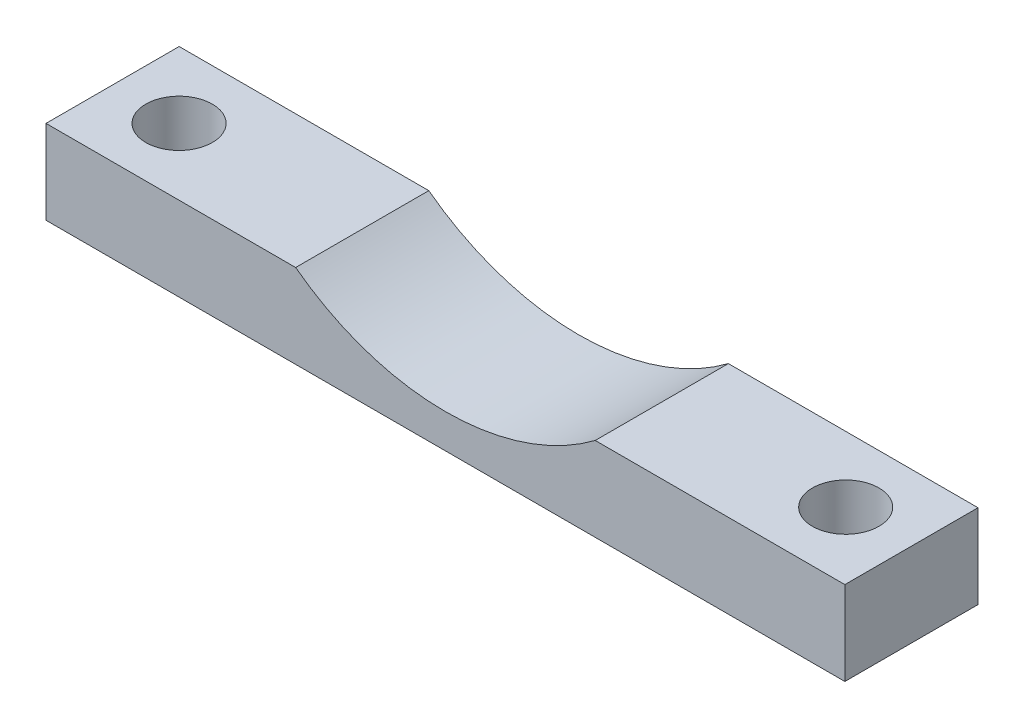
ISO-10303-21;
HEADER;
FILE_DESCRIPTION(('STEP AP214'),'2;1');
FILE_NAME('part.step','',(''),(''),'','','');
FILE_SCHEMA(('AUTOMOTIVE_DESIGN { 1 0 10303 214 1 1 1 1 }'));
ENDSEC;
DATA;
#1=APPLICATION_CONTEXT('core data for automotive mechanical design processes');
#2=APPLICATION_PROTOCOL_DEFINITION('international standard','automotive_design',2000,#1);
#3=PRODUCT_CONTEXT('',#1,'mechanical');
#4=PRODUCT('Part','Part','',(#3));
#5=PRODUCT_RELATED_PRODUCT_CATEGORY('part','',(#4));
#6=PRODUCT_DEFINITION_FORMATION('','',#4);
#7=PRODUCT_DEFINITION_CONTEXT('part definition',#1,'design');
#8=PRODUCT_DEFINITION('design','',#6,#7);
#9=PRODUCT_DEFINITION_SHAPE('','',#8);
#10=(LENGTH_UNIT() NAMED_UNIT(*) SI_UNIT(.MILLI.,.METRE.));
#11=(NAMED_UNIT(*) PLANE_ANGLE_UNIT() SI_UNIT($,.RADIAN.));
#12=(NAMED_UNIT(*) SI_UNIT($,.STERADIAN.) SOLID_ANGLE_UNIT());
#13=UNCERTAINTY_MEASURE_WITH_UNIT(LENGTH_MEASURE(1.E-05),#10,'distance_accuracy_value','');
#14=(GEOMETRIC_REPRESENTATION_CONTEXT(3) GLOBAL_UNCERTAINTY_ASSIGNED_CONTEXT((#13)) GLOBAL_UNIT_ASSIGNED_CONTEXT((#10,
#11,#12)) REPRESENTATION_CONTEXT('',''));
#15=CARTESIAN_POINT('',(0.,0.,0.));
#16=DIRECTION('',(0.,0.,1.));
#17=DIRECTION('',(1.,0.,0.));
#18=AXIS2_PLACEMENT_3D('',#15,#16,#17);
#19=CARTESIAN_POINT('',(0.0140913550925603,-0.0271199820524089,10.16));
#20=DIRECTION('',(0.,0.,-1.));
#21=DIRECTION('',(-1.,0.,0.));
#22=AXIS2_PLACEMENT_3D('',#19,#20,#21);
#23=CYLINDRICAL_SURFACE('',#22,19.05);
#24=CARTESIAN_POINT('',(0.0140913550925603,-0.0271199820524089,0.));
#25=DIRECTION('',(0.,0.,-1.));
#26=DIRECTION('',(1.,0.,0.));
#27=AXIS2_PLACEMENT_3D('',#24,#25,#26);
#28=CIRCLE('',#27,19.05);
#29=CARTESIAN_POINT('',(11.4440913550926,-15.2671199820524,0.));
#30=VERTEX_POINT('',#29);
#31=CARTESIAN_POINT('',(-11.4159086449074,-15.2671199820524,0.));
#32=VERTEX_POINT('',#31);
#33=EDGE_CURVE('E123',#30,#32,#28,.T.);
#34=ORIENTED_EDGE('',*,*,#33,.T.);
#35=DIRECTION('',(0.,0.,-1.));
#36=VECTOR('',#35,1.);
#37=CARTESIAN_POINT('',(-11.4159086449074,-15.2671199820524,10.16));
#38=LINE('',#37,#36);
#39=CARTESIAN_POINT('',(-11.4159086449074,-15.2671199820524,10.16));
#40=VERTEX_POINT('',#39);
#41=EDGE_CURVE('E11',#40,#32,#38,.T.);
#42=ORIENTED_EDGE('',*,*,#41,.F.);
#43=CARTESIAN_POINT('',(0.0140913550925603,-0.0271199820524089,10.16));
#44=DIRECTION('',(0.,0.,-1.));
#45=DIRECTION('',(1.,0.,0.));
#46=AXIS2_PLACEMENT_3D('',#43,#44,#45);
#47=CIRCLE('',#46,19.05);
#48=CARTESIAN_POINT('',(11.4440913550926,-15.2671199820524,10.16));
#49=VERTEX_POINT('',#48);
#50=EDGE_CURVE('E134',#49,#40,#47,.T.);
#51=ORIENTED_EDGE('',*,*,#50,.F.);
#52=DIRECTION('',(0.,0.,-1.));
#53=VECTOR('',#52,1.);
#54=CARTESIAN_POINT('',(11.4440913550926,-15.2671199820524,10.16));
#55=LINE('',#54,#53);
#56=EDGE_CURVE('E119',#49,#30,#55,.T.);
#57=ORIENTED_EDGE('',*,*,#56,.T.);
#58=EDGE_LOOP('',(#34,#42,#51,#57));
#59=FACE_BOUND('',#58,.T.);
#60=ADVANCED_FACE('F39',(#59),#23,.F.);
#61=CARTESIAN_POINT('',(-11.4159086449074,-15.2671199820524,10.16));
#62=DIRECTION('',(0.,-1.,0.));
#63=DIRECTION('',(1.,0.,0.));
#64=AXIS2_PLACEMENT_3D('',#61,#62,#63);
#65=PLANE('',#64);
#66=CARTESIAN_POINT('',(-25.3929543224537,-15.2671199820524,5.08));
#67=DIRECTION('',(0.,1.,0.));
#68=DIRECTION('',(-1.,0.,0.));
#69=AXIS2_PLACEMENT_3D('',#66,#67,#68);
#70=CIRCLE('',#69,2.54);
#71=CARTESIAN_POINT('',(-27.9329543224537,-15.2671199820524,5.08));
#72=VERTEX_POINT('',#71);
#73=EDGE_CURVE('E185',#72,#72,#70,.T.);
#74=ORIENTED_EDGE('',*,*,#73,.F.);
#75=EDGE_LOOP('',(#74));
#76=FACE_BOUND('',#75,.T.);
#77=DIRECTION('',(-1.,0.,0.));
#78=VECTOR('',#77,1.);
#79=CARTESIAN_POINT('',(-11.4159086449074,-15.2671199820524,0.));
#80=LINE('',#79,#78);
#81=CARTESIAN_POINT('',(-30.4659086449074,-15.2671199820524,0.));
#82=VERTEX_POINT('',#81);
#83=EDGE_CURVE('E126',#32,#82,#80,.T.);
#84=ORIENTED_EDGE('',*,*,#83,.T.);
#85=DIRECTION('',(0.,0.,-1.));
#86=VECTOR('',#85,1.);
#87=CARTESIAN_POINT('',(-30.4659086449074,-15.2671199820524,10.16));
#88=LINE('',#87,#86);
#89=CARTESIAN_POINT('',(-30.4659086449074,-15.2671199820524,10.16));
#90=VERTEX_POINT('',#89);
#91=EDGE_CURVE('E47',#90,#82,#88,.T.);
#92=ORIENTED_EDGE('',*,*,#91,.F.);
#93=DIRECTION('',(-1.,0.,0.));
#94=VECTOR('',#93,1.);
#95=CARTESIAN_POINT('',(-11.4159086449074,-15.2671199820524,10.16));
#96=LINE('',#95,#94);
#97=EDGE_CURVE('E92',#40,#90,#96,.T.);
#98=ORIENTED_EDGE('',*,*,#97,.F.);
#99=ORIENTED_EDGE('',*,*,#41,.T.);
#100=EDGE_LOOP('',(#84,#92,#98,#99));
#101=FACE_BOUND('',#100,.T.);
#102=ADVANCED_FACE('F160',(#76,#101),#65,.F.);
#103=CARTESIAN_POINT('',(-30.4659086449074,-15.2671199820524,10.16));
#104=DIRECTION('',(1.,0.,0.));
#105=DIRECTION('',(0.,0.,-1.));
#106=AXIS2_PLACEMENT_3D('',#103,#104,#105);
#107=PLANE('',#106);
#108=DIRECTION('',(0.,-1.,0.));
#109=VECTOR('',#108,1.);
#110=CARTESIAN_POINT('',(-30.4659086449074,-15.2671199820524,0.));
#111=LINE('',#110,#109);
#112=CARTESIAN_POINT('',(-30.4659086449074,-21.6713190814874,0.));
#113=VERTEX_POINT('',#112);
#114=EDGE_CURVE('E129',#82,#113,#111,.T.);
#115=ORIENTED_EDGE('',*,*,#114,.T.);
#116=DIRECTION('',(0.,0.,-1.));
#117=VECTOR('',#116,1.);
#118=CARTESIAN_POINT('',(-30.4659086449074,-21.6713190814874,10.16));
#119=LINE('',#118,#117);
#120=CARTESIAN_POINT('',(-30.4659086449074,-21.6713190814874,10.16));
#121=VERTEX_POINT('',#120);
#122=EDGE_CURVE('E114',#121,#113,#119,.T.);
#123=ORIENTED_EDGE('',*,*,#122,.F.);
#124=DIRECTION('',(0.,-1.,0.));
#125=VECTOR('',#124,1.);
#126=CARTESIAN_POINT('',(-30.4659086449074,-15.2671199820524,10.16));
#127=LINE('',#126,#125);
#128=EDGE_CURVE('E105',#90,#121,#127,.T.);
#129=ORIENTED_EDGE('',*,*,#128,.F.);
#130=ORIENTED_EDGE('',*,*,#91,.T.);
#131=EDGE_LOOP('',(#115,#123,#129,#130));
#132=FACE_BOUND('',#131,.T.);
#133=ADVANCED_FACE('F140',(#132),#107,.F.);
#134=CARTESIAN_POINT('',(-30.4659086449074,-21.6713190814874,10.16));
#135=DIRECTION('',(0.,1.,0.));
#136=DIRECTION('',(0.,0.,1.));
#137=AXIS2_PLACEMENT_3D('',#134,#135,#136);
#138=PLANE('',#137);
#139=CARTESIAN_POINT('',(-25.3929543224537,-21.6713190814874,5.08));
#140=DIRECTION('',(0.,1.,0.));
#141=DIRECTION('',(-1.,0.,0.));
#142=AXIS2_PLACEMENT_3D('',#139,#140,#141);
#143=CIRCLE('',#142,2.54);
#144=CARTESIAN_POINT('',(-27.9329543224537,-21.6713190814874,5.08));
#145=VERTEX_POINT('',#144);
#146=EDGE_CURVE('E127',#145,#145,#143,.T.);
#147=ORIENTED_EDGE('',*,*,#146,.T.);
#148=EDGE_LOOP('',(#147));
#149=FACE_BOUND('',#148,.T.);
#150=CARTESIAN_POINT('',(25.4069479581042,-21.6713190814874,5.00954336006865));
#151=DIRECTION('',(0.,1.,0.));
#152=DIRECTION('',(1.,0.,0.));
#153=AXIS2_PLACEMENT_3D('',#150,#151,#152);
#154=CIRCLE('',#153,2.54);
#155=CARTESIAN_POINT('',(27.9469479581042,-21.6713190814874,5.00954336006865));
#156=VERTEX_POINT('',#155);
#157=EDGE_CURVE('E180',#156,#156,#154,.T.);
#158=ORIENTED_EDGE('',*,*,#157,.T.);
#159=EDGE_LOOP('',(#158));
#160=FACE_BOUND('',#159,.T.);
#161=DIRECTION('',(1.,0.,0.));
#162=VECTOR('',#161,1.);
#163=CARTESIAN_POINT('',(-30.4659086449074,-21.6713190814874,0.));
#164=LINE('',#163,#162);
#165=CARTESIAN_POINT('',(30.4940913550926,-21.6713190814874,0.));
#166=VERTEX_POINT('',#165);
#167=EDGE_CURVE('E113',#113,#166,#164,.T.);
#168=ORIENTED_EDGE('',*,*,#167,.T.);
#169=DIRECTION('',(0.,0.,-1.));
#170=VECTOR('',#169,1.);
#171=CARTESIAN_POINT('',(30.4940913550926,-21.6713190814874,10.16));
#172=LINE('',#171,#170);
#173=CARTESIAN_POINT('',(30.4940913550926,-21.6713190814874,10.16));
#174=VERTEX_POINT('',#173);
#175=EDGE_CURVE('E110',#174,#166,#172,.T.);
#176=ORIENTED_EDGE('',*,*,#175,.F.);
#177=DIRECTION('',(1.,0.,0.));
#178=VECTOR('',#177,1.);
#179=CARTESIAN_POINT('',(-30.4659086449074,-21.6713190814874,10.16));
#180=LINE('',#179,#178);
#181=EDGE_CURVE('E99',#121,#174,#180,.T.);
#182=ORIENTED_EDGE('',*,*,#181,.F.);
#183=ORIENTED_EDGE('',*,*,#122,.T.);
#184=EDGE_LOOP('',(#168,#176,#182,#183));
#185=FACE_BOUND('',#184,.T.);
#186=ADVANCED_FACE('F111',(#149,#160,#185),#138,.F.);
#187=CARTESIAN_POINT('',(30.4940913550926,-21.6713190814874,10.16));
#188=DIRECTION('',(-1.,0.,0.));
#189=DIRECTION('',(0.,0.,1.));
#190=AXIS2_PLACEMENT_3D('',#187,#188,#189);
#191=PLANE('',#190);
#192=DIRECTION('',(0.,1.,0.));
#193=VECTOR('',#192,1.);
#194=CARTESIAN_POINT('',(30.4940913550926,-21.6713190814874,0.));
#195=LINE('',#194,#193);
#196=CARTESIAN_POINT('',(30.4940913550926,-15.2671199820524,0.));
#197=VERTEX_POINT('',#196);
#198=EDGE_CURVE('E78',#166,#197,#195,.T.);
#199=ORIENTED_EDGE('',*,*,#198,.T.);
#200=DIRECTION('',(0.,0.,-1.));
#201=VECTOR('',#200,1.);
#202=CARTESIAN_POINT('',(30.4940913550926,-15.2671199820524,10.16));
#203=LINE('',#202,#201);
#204=CARTESIAN_POINT('',(30.4940913550926,-15.2671199820524,10.16));
#205=VERTEX_POINT('',#204);
#206=EDGE_CURVE('E115',#205,#197,#203,.T.);
#207=ORIENTED_EDGE('',*,*,#206,.F.);
#208=DIRECTION('',(0.,1.,0.));
#209=VECTOR('',#208,1.);
#210=CARTESIAN_POINT('',(30.4940913550926,-21.6713190814874,10.16));
#211=LINE('',#210,#209);
#212=EDGE_CURVE('E103',#174,#205,#211,.T.);
#213=ORIENTED_EDGE('',*,*,#212,.F.);
#214=ORIENTED_EDGE('',*,*,#175,.T.);
#215=EDGE_LOOP('',(#199,#207,#213,#214));
#216=FACE_BOUND('',#215,.T.);
#217=ADVANCED_FACE('F117',(#216),#191,.F.);
#218=CARTESIAN_POINT('',(11.4440913550926,-15.2671199820524,10.16));
#219=DIRECTION('',(0.,-1.,0.));
#220=DIRECTION('',(0.,0.,-1.));
#221=AXIS2_PLACEMENT_3D('',#218,#219,#220);
#222=PLANE('',#221);
#223=CARTESIAN_POINT('',(25.4069479581042,-15.2671199820524,5.00954336006865));
#224=DIRECTION('',(0.,1.,0.));
#225=DIRECTION('',(1.,0.,0.));
#226=AXIS2_PLACEMENT_3D('',#223,#224,#225);
#227=CIRCLE('',#226,2.54);
#228=CARTESIAN_POINT('',(27.9469479581042,-15.2671199820524,5.00954336006865));
#229=VERTEX_POINT('',#228);
#230=EDGE_CURVE('E182',#229,#229,#227,.T.);
#231=ORIENTED_EDGE('',*,*,#230,.F.);
#232=EDGE_LOOP('',(#231));
#233=FACE_BOUND('',#232,.T.);
#234=DIRECTION('',(-1.,0.,0.));
#235=VECTOR('',#234,1.);
#236=CARTESIAN_POINT('',(11.4440913550926,-15.2671199820524,0.));
#237=LINE('',#236,#235);
#238=EDGE_CURVE('E84',#197,#30,#237,.T.);
#239=ORIENTED_EDGE('',*,*,#238,.T.);
#240=ORIENTED_EDGE('',*,*,#56,.F.);
#241=DIRECTION('',(-1.,0.,0.));
#242=VECTOR('',#241,1.);
#243=CARTESIAN_POINT('',(11.4440913550926,-15.2671199820524,10.16));
#244=LINE('',#243,#242);
#245=EDGE_CURVE('E55',#205,#49,#244,.T.);
#246=ORIENTED_EDGE('',*,*,#245,.F.);
#247=ORIENTED_EDGE('',*,*,#206,.T.);
#248=EDGE_LOOP('',(#239,#240,#246,#247));
#249=FACE_BOUND('',#248,.T.);
#250=ADVANCED_FACE('F147',(#233,#249),#222,.F.);
#251=CARTESIAN_POINT('',(0.0140913550925603,-0.0271199820524089,10.16));
#252=DIRECTION('',(0.,0.,1.));
#253=DIRECTION('',(1.,0.,0.));
#254=AXIS2_PLACEMENT_3D('',#251,#252,#253);
#255=PLANE('',#254);
#256=ORIENTED_EDGE('',*,*,#50,.T.);
#257=ORIENTED_EDGE('',*,*,#97,.T.);
#258=ORIENTED_EDGE('',*,*,#128,.T.);
#259=ORIENTED_EDGE('',*,*,#181,.T.);
#260=ORIENTED_EDGE('',*,*,#212,.T.);
#261=ORIENTED_EDGE('',*,*,#245,.T.);
#262=EDGE_LOOP('',(#256,#257,#258,#259,#260,#261));
#263=FACE_BOUND('',#262,.T.);
#264=ADVANCED_FACE('F101',(#263),#255,.T.);
#265=CARTESIAN_POINT('',(0.0140913550925603,-0.0271199820524089,0.));
#266=DIRECTION('',(0.,0.,1.));
#267=DIRECTION('',(1.,0.,0.));
#268=AXIS2_PLACEMENT_3D('',#265,#266,#267);
#269=PLANE('',#268);
#270=ORIENTED_EDGE('',*,*,#33,.F.);
#271=ORIENTED_EDGE('',*,*,#238,.F.);
#272=ORIENTED_EDGE('',*,*,#198,.F.);
#273=ORIENTED_EDGE('',*,*,#167,.F.);
#274=ORIENTED_EDGE('',*,*,#114,.F.);
#275=ORIENTED_EDGE('',*,*,#83,.F.);
#276=EDGE_LOOP('',(#270,#271,#272,#273,#274,#275));
#277=FACE_BOUND('',#276,.T.);
#278=ADVANCED_FACE('F143',(#277),#269,.F.);
#279=CARTESIAN_POINT('',(25.4069479581042,-21.6713190814874,5.00954336006865));
#280=DIRECTION('',(0.,1.,0.));
#281=DIRECTION('',(-1.,0.,0.));
#282=AXIS2_PLACEMENT_3D('',#279,#280,#281);
#283=CYLINDRICAL_SURFACE('',#282,2.54);
#284=ORIENTED_EDGE('',*,*,#157,.F.);
#285=EDGE_LOOP('',(#284));
#286=FACE_BOUND('',#285,.T.);
#287=ORIENTED_EDGE('',*,*,#230,.T.);
#288=EDGE_LOOP('',(#287));
#289=FACE_BOUND('',#288,.T.);
#290=ADVANCED_FACE('F195',(#286,#289),#283,.F.);
#291=CARTESIAN_POINT('',(-25.3929543224537,-21.6713190814874,5.08));
#292=DIRECTION('',(0.,1.,0.));
#293=DIRECTION('',(-1.,0.,0.));
#294=AXIS2_PLACEMENT_3D('',#291,#292,#293);
#295=CYLINDRICAL_SURFACE('',#294,2.54);
#296=ORIENTED_EDGE('',*,*,#146,.F.);
#297=EDGE_LOOP('',(#296));
#298=FACE_BOUND('',#297,.T.);
#299=ORIENTED_EDGE('',*,*,#73,.T.);
#300=EDGE_LOOP('',(#299));
#301=FACE_BOUND('',#300,.T.);
#302=ADVANCED_FACE('F193',(#298,#301),#295,.F.);
#303=CLOSED_SHELL('',(#60,#102,#133,#186,#217,#250,#264,#278,#290,#302));
#304=MANIFOLD_SOLID_BREP('B2',#303);
#305=ADVANCED_BREP_SHAPE_REPRESENTATION('',(#18,#304),#14);
#306=SHAPE_DEFINITION_REPRESENTATION(#9,#305);
ENDSEC;
END-ISO-10303-21;
